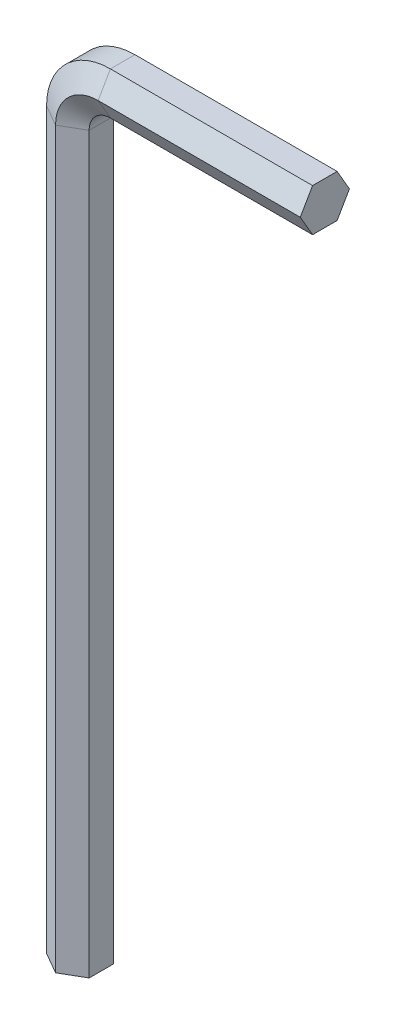
ISO-10303-21;
HEADER;
FILE_DESCRIPTION(('STEP AP214'),'2;1');
FILE_NAME('part.step','',(''),(''),'','','');
FILE_SCHEMA(('AUTOMOTIVE_DESIGN { 1 0 10303 214 1 1 1 1 }'));
ENDSEC;
DATA;
#1=APPLICATION_CONTEXT('core data for automotive mechanical design processes');
#2=APPLICATION_PROTOCOL_DEFINITION('international standard','automotive_design',2000,#1);
#3=PRODUCT_CONTEXT('',#1,'mechanical');
#4=PRODUCT('Part','Part','',(#3));
#5=PRODUCT_RELATED_PRODUCT_CATEGORY('part','',(#4));
#6=PRODUCT_DEFINITION_FORMATION('','',#4);
#7=PRODUCT_DEFINITION_CONTEXT('part definition',#1,'design');
#8=PRODUCT_DEFINITION('design','',#6,#7);
#9=PRODUCT_DEFINITION_SHAPE('','',#8);
#10=(LENGTH_UNIT() NAMED_UNIT(*) SI_UNIT(.MILLI.,.METRE.));
#11=(NAMED_UNIT(*) PLANE_ANGLE_UNIT() SI_UNIT($,.RADIAN.));
#12=(NAMED_UNIT(*) SI_UNIT($,.STERADIAN.) SOLID_ANGLE_UNIT());
#13=UNCERTAINTY_MEASURE_WITH_UNIT(LENGTH_MEASURE(1.E-05),#10,'distance_accuracy_value','');
#14=(GEOMETRIC_REPRESENTATION_CONTEXT(3) GLOBAL_UNCERTAINTY_ASSIGNED_CONTEXT((#13)) GLOBAL_UNIT_ASSIGNED_CONTEXT((#10,
#11,#12)) REPRESENTATION_CONTEXT('',''));
#15=CARTESIAN_POINT('',(0.,0.,0.));
#16=DIRECTION('',(0.,0.,1.));
#17=DIRECTION('',(1.,0.,0.));
#18=AXIS2_PLACEMENT_3D('',#15,#16,#17);
#19=CARTESIAN_POINT('',(0.,0.,0.));
#20=DIRECTION('',(1.,0.,0.));
#21=DIRECTION('',(0.,0.,-1.));
#22=AXIS2_PLACEMENT_3D('',#19,#20,#21);
#23=PLANE('',#22);
#24=DIRECTION('',(0.,0.866025403784438,-0.5));
#25=VECTOR('',#24,1.);
#26=CARTESIAN_POINT('',(0.,-4.,-1.15470053837925));
#27=LINE('',#26,#25);
#28=CARTESIAN_POINT('',(0.,-4.,-1.15470053837925));
#29=VERTEX_POINT('',#28);
#30=CARTESIAN_POINT('',(0.,-2.,-2.3094010767585));
#31=VERTEX_POINT('',#30);
#32=EDGE_CURVE('E198',#29,#31,#27,.T.);
#33=ORIENTED_EDGE('',*,*,#32,.T.);
#34=DIRECTION('',(0.,0.866025403784438,0.5));
#35=VECTOR('',#34,1.);
#36=CARTESIAN_POINT('',(0.,-2.,-2.3094010767585));
#37=LINE('',#36,#35);
#38=CARTESIAN_POINT('',(0.,0.,-1.15470053837925));
#39=VERTEX_POINT('',#38);
#40=EDGE_CURVE('E157',#31,#39,#37,.T.);
#41=ORIENTED_EDGE('',*,*,#40,.T.);
#42=DIRECTION('',(0.,0.,1.));
#43=VECTOR('',#42,1.);
#44=CARTESIAN_POINT('',(0.,0.,-1.15470053837925));
#45=LINE('',#44,#43);
#46=CARTESIAN_POINT('',(0.,0.,1.15470053837925));
#47=VERTEX_POINT('',#46);
#48=EDGE_CURVE('E149',#39,#47,#45,.T.);
#49=ORIENTED_EDGE('',*,*,#48,.T.);
#50=DIRECTION('',(0.,-0.866025403784438,0.5));
#51=VECTOR('',#50,1.);
#52=CARTESIAN_POINT('',(0.,0.,1.15470053837925));
#53=LINE('',#52,#51);
#54=CARTESIAN_POINT('',(0.,-2.,2.3094010767585));
#55=VERTEX_POINT('',#54);
#56=EDGE_CURVE('E142',#47,#55,#53,.T.);
#57=ORIENTED_EDGE('',*,*,#56,.T.);
#58=DIRECTION('',(0.,-0.866025403784438,-0.5));
#59=VECTOR('',#58,1.);
#60=CARTESIAN_POINT('',(0.,-2.,2.3094010767585));
#61=LINE('',#60,#59);
#62=CARTESIAN_POINT('',(0.,-4.,1.15470053837925));
#63=VERTEX_POINT('',#62);
#64=EDGE_CURVE('E223',#55,#63,#61,.T.);
#65=ORIENTED_EDGE('',*,*,#64,.T.);
#66=DIRECTION('',(0.,0.,-1.));
#67=VECTOR('',#66,1.);
#68=CARTESIAN_POINT('',(0.,-4.,1.15470053837925));
#69=LINE('',#68,#67);
#70=EDGE_CURVE('E237',#63,#29,#69,.T.);
#71=ORIENTED_EDGE('',*,*,#70,.T.);
#72=EDGE_LOOP('',(#33,#41,#49,#57,#65,#71));
#73=FACE_BOUND('',#72,.T.);
#74=ADVANCED_FACE('F43',(#73),#23,.T.);
#75=CARTESIAN_POINT('',(-25.,-75.,0.));
#76=DIRECTION('',(0.,1.,0.));
#77=DIRECTION('',(0.,0.,-1.));
#78=AXIS2_PLACEMENT_3D('',#75,#76,#77);
#79=PLANE('',#78);
#80=DIRECTION('',(-0.866025403784438,0.,-0.5));
#81=VECTOR('',#80,1.);
#82=CARTESIAN_POINT('',(-21.,-75.,-1.15470053837925));
#83=LINE('',#82,#81);
#84=CARTESIAN_POINT('',(-21.,-75.,-1.15470053837925));
#85=VERTEX_POINT('',#84);
#86=CARTESIAN_POINT('',(-23.,-75.,-2.3094010767585));
#87=VERTEX_POINT('',#86);
#88=EDGE_CURVE('E171',#85,#87,#83,.T.);
#89=ORIENTED_EDGE('',*,*,#88,.F.);
#90=DIRECTION('',(0.,0.,-1.));
#91=VECTOR('',#90,1.);
#92=CARTESIAN_POINT('',(-21.,-75.,1.15470053837925));
#93=LINE('',#92,#91);
#94=CARTESIAN_POINT('',(-21.,-75.,1.15470053837925));
#95=VERTEX_POINT('',#94);
#96=EDGE_CURVE('E11',#95,#85,#93,.T.);
#97=ORIENTED_EDGE('',*,*,#96,.F.);
#98=DIRECTION('',(0.866025403784438,0.,-0.5));
#99=VECTOR('',#98,1.);
#100=CARTESIAN_POINT('',(-23.,-75.,2.3094010767585));
#101=LINE('',#100,#99);
#102=CARTESIAN_POINT('',(-23.,-75.,2.3094010767585));
#103=VERTEX_POINT('',#102);
#104=EDGE_CURVE('E57',#103,#95,#101,.T.);
#105=ORIENTED_EDGE('',*,*,#104,.F.);
#106=DIRECTION('',(0.866025403784438,0.,0.5));
#107=VECTOR('',#106,1.);
#108=CARTESIAN_POINT('',(-25.,-75.,1.15470053837925));
#109=LINE('',#108,#107);
#110=CARTESIAN_POINT('',(-25.,-75.,1.15470053837925));
#111=VERTEX_POINT('',#110);
#112=EDGE_CURVE('E66',#111,#103,#109,.T.);
#113=ORIENTED_EDGE('',*,*,#112,.F.);
#114=DIRECTION('',(0.,0.,1.));
#115=VECTOR('',#114,1.);
#116=CARTESIAN_POINT('',(-25.,-75.,-1.15470053837925));
#117=LINE('',#116,#115);
#118=CARTESIAN_POINT('',(-25.,-75.,-1.15470053837925));
#119=VERTEX_POINT('',#118);
#120=EDGE_CURVE('E184',#119,#111,#117,.T.);
#121=ORIENTED_EDGE('',*,*,#120,.F.);
#122=DIRECTION('',(-0.866025403784438,0.,0.5));
#123=VECTOR('',#122,1.);
#124=CARTESIAN_POINT('',(-23.,-75.,-2.3094010767585));
#125=LINE('',#124,#123);
#126=EDGE_CURVE('E182',#87,#119,#125,.T.);
#127=ORIENTED_EDGE('',*,*,#126,.F.);
#128=EDGE_LOOP('',(#89,#97,#105,#113,#121,#127));
#129=FACE_BOUND('',#128,.T.);
#130=ADVANCED_FACE('F183',(#129),#79,.F.);
#131=CARTESIAN_POINT('',(0.,-4.,-1.15470053837925));
#132=DIRECTION('',(0.,0.5,0.866025403784439));
#133=DIRECTION('',(0.,-0.866025403784438,0.5));
#134=AXIS2_PLACEMENT_3D('',#131,#132,#133);
#135=PLANE('',#134);
#136=DIRECTION('',(-1.,0.,0.));
#137=VECTOR('',#136,1.);
#138=CARTESIAN_POINT('',(0.,-2.,-2.3094010767585));
#139=LINE('',#138,#137);
#140=CARTESIAN_POINT('',(-19.,-2.,-2.3094010767585));
#141=VERTEX_POINT('',#140);
#142=EDGE_CURVE('E203',#31,#141,#139,.T.);
#143=ORIENTED_EDGE('',*,*,#142,.F.);
#144=ORIENTED_EDGE('',*,*,#32,.F.);
#145=DIRECTION('',(-1.,0.,0.));
#146=VECTOR('',#145,1.);
#147=CARTESIAN_POINT('',(0.,-4.,-1.15470053837925));
#148=LINE('',#147,#146);
#149=CARTESIAN_POINT('',(-19.,-4.,-1.15470053837925));
#150=VERTEX_POINT('',#149);
#151=EDGE_CURVE('E253',#29,#150,#148,.T.);
#152=ORIENTED_EDGE('',*,*,#151,.T.);
#153=DIRECTION('',(0.,0.866025403784438,-0.5));
#154=VECTOR('',#153,1.);
#155=CARTESIAN_POINT('',(-19.,-4.,-1.15470053837925));
#156=LINE('',#155,#154);
#157=EDGE_CURVE('E269',#150,#141,#156,.T.);
#158=ORIENTED_EDGE('',*,*,#157,.T.);
#159=EDGE_LOOP('',(#143,#144,#152,#158));
#160=FACE_BOUND('',#159,.T.);
#161=ADVANCED_FACE('F280',(#160),#135,.F.);
#162=CARTESIAN_POINT('',(0.,-2.,-2.3094010767585));
#163=DIRECTION('',(0.,-0.5,0.866025403784438));
#164=DIRECTION('',(0.,-0.866025403784438,-0.5));
#165=AXIS2_PLACEMENT_3D('',#162,#163,#164);
#166=PLANE('',#165);
#167=DIRECTION('',(-1.,0.,0.));
#168=VECTOR('',#167,1.);
#169=CARTESIAN_POINT('',(0.,0.,-1.15470053837925));
#170=LINE('',#169,#168);
#171=CARTESIAN_POINT('',(-19.,0.,-1.15470053837925));
#172=VERTEX_POINT('',#171);
#173=EDGE_CURVE('E202',#39,#172,#170,.T.);
#174=ORIENTED_EDGE('',*,*,#173,.F.);
#175=ORIENTED_EDGE('',*,*,#40,.F.);
#176=ORIENTED_EDGE('',*,*,#142,.T.);
#177=DIRECTION('',(0.,0.866025403784438,0.5));
#178=VECTOR('',#177,1.);
#179=CARTESIAN_POINT('',(-19.,-2.,-2.3094010767585));
#180=LINE('',#179,#178);
#181=EDGE_CURVE('E199',#141,#172,#180,.T.);
#182=ORIENTED_EDGE('',*,*,#181,.T.);
#183=EDGE_LOOP('',(#174,#175,#176,#182));
#184=FACE_BOUND('',#183,.T.);
#185=ADVANCED_FACE('F281',(#184),#166,.F.);
#186=CARTESIAN_POINT('',(0.,0.,-1.15470053837925));
#187=DIRECTION('',(0.,-1.,0.));
#188=DIRECTION('',(1.,0.,0.));
#189=AXIS2_PLACEMENT_3D('',#186,#187,#188);
#190=PLANE('',#189);
#191=DIRECTION('',(-1.,0.,0.));
#192=VECTOR('',#191,1.);
#193=CARTESIAN_POINT('',(0.,0.,1.15470053837925));
#194=LINE('',#193,#192);
#195=CARTESIAN_POINT('',(-19.,0.,1.15470053837925));
#196=VERTEX_POINT('',#195);
#197=EDGE_CURVE('E214',#47,#196,#194,.T.);
#198=ORIENTED_EDGE('',*,*,#197,.F.);
#199=ORIENTED_EDGE('',*,*,#48,.F.);
#200=ORIENTED_EDGE('',*,*,#173,.T.);
#201=DIRECTION('',(0.,0.,1.));
#202=VECTOR('',#201,1.);
#203=CARTESIAN_POINT('',(-19.,0.,-1.15470053837925));
#204=LINE('',#203,#202);
#205=EDGE_CURVE('E205',#172,#196,#204,.T.);
#206=ORIENTED_EDGE('',*,*,#205,.T.);
#207=EDGE_LOOP('',(#198,#199,#200,#206));
#208=FACE_BOUND('',#207,.T.);
#209=ADVANCED_FACE('F335',(#208),#190,.F.);
#210=CARTESIAN_POINT('',(0.,0.,1.15470053837925));
#211=DIRECTION('',(0.,-0.5,-0.866025403784439));
#212=DIRECTION('',(0.,0.866025403784439,-0.5));
#213=AXIS2_PLACEMENT_3D('',#210,#211,#212);
#214=PLANE('',#213);
#215=DIRECTION('',(-1.,0.,0.));
#216=VECTOR('',#215,1.);
#217=CARTESIAN_POINT('',(0.,-2.,2.3094010767585));
#218=LINE('',#217,#216);
#219=CARTESIAN_POINT('',(-19.,-2.,2.3094010767585));
#220=VERTEX_POINT('',#219);
#221=EDGE_CURVE('E226',#55,#220,#218,.T.);
#222=ORIENTED_EDGE('',*,*,#221,.F.);
#223=ORIENTED_EDGE('',*,*,#56,.F.);
#224=ORIENTED_EDGE('',*,*,#197,.T.);
#225=DIRECTION('',(0.,-0.866025403784438,0.5));
#226=VECTOR('',#225,1.);
#227=CARTESIAN_POINT('',(-19.,0.,1.15470053837925));
#228=LINE('',#227,#226);
#229=EDGE_CURVE('E216',#196,#220,#228,.T.);
#230=ORIENTED_EDGE('',*,*,#229,.T.);
#231=EDGE_LOOP('',(#222,#223,#224,#230));
#232=FACE_BOUND('',#231,.T.);
#233=ADVANCED_FACE('F343',(#232),#214,.F.);
#234=CARTESIAN_POINT('',(0.,-2.,2.3094010767585));
#235=DIRECTION('',(0.,0.5,-0.866025403784439));
#236=DIRECTION('',(0.,0.866025403784439,0.5));
#237=AXIS2_PLACEMENT_3D('',#234,#235,#236);
#238=PLANE('',#237);
#239=DIRECTION('',(-1.,0.,0.));
#240=VECTOR('',#239,1.);
#241=CARTESIAN_POINT('',(0.,-4.,1.15470053837925));
#242=LINE('',#241,#240);
#243=CARTESIAN_POINT('',(-19.,-4.,1.15470053837925));
#244=VERTEX_POINT('',#243);
#245=EDGE_CURVE('E240',#63,#244,#242,.T.);
#246=ORIENTED_EDGE('',*,*,#245,.F.);
#247=ORIENTED_EDGE('',*,*,#64,.F.);
#248=ORIENTED_EDGE('',*,*,#221,.T.);
#249=DIRECTION('',(0.,-0.866025403784438,-0.5));
#250=VECTOR('',#249,1.);
#251=CARTESIAN_POINT('',(-19.,-2.,2.3094010767585));
#252=LINE('',#251,#250);
#253=EDGE_CURVE('E229',#220,#244,#252,.T.);
#254=ORIENTED_EDGE('',*,*,#253,.T.);
#255=EDGE_LOOP('',(#246,#247,#248,#254));
#256=FACE_BOUND('',#255,.T.);
#257=ADVANCED_FACE('F352',(#256),#238,.F.);
#258=CARTESIAN_POINT('',(0.,-4.,1.15470053837925));
#259=DIRECTION('',(0.,1.,0.));
#260=DIRECTION('',(-1.,0.,0.));
#261=AXIS2_PLACEMENT_3D('',#258,#259,#260);
#262=PLANE('',#261);
#263=DIRECTION('',(0.,0.,-1.));
#264=VECTOR('',#263,1.);
#265=CARTESIAN_POINT('',(-19.,-4.,1.15470053837925));
#266=LINE('',#265,#264);
#267=EDGE_CURVE('E243',#244,#150,#266,.T.);
#268=ORIENTED_EDGE('',*,*,#267,.T.);
#269=ORIENTED_EDGE('',*,*,#151,.F.);
#270=ORIENTED_EDGE('',*,*,#70,.F.);
#271=ORIENTED_EDGE('',*,*,#245,.T.);
#272=EDGE_LOOP('',(#268,#269,#270,#271));
#273=FACE_BOUND('',#272,.T.);
#274=ADVANCED_FACE('F292',(#273),#262,.F.);
#275=CARTESIAN_POINT('',(-19.,-6.,-1.15470053837925));
#276=DIRECTION('',(0.,0.,-1.));
#277=DIRECTION('',(-1.,0.,0.));
#278=AXIS2_PLACEMENT_3D('',#275,#276,#277);
#279=CONICAL_SURFACE('',#278,2.,1.0471975511966);
#280=CARTESIAN_POINT('',(-19.,-6.,-2.3094010767585));
#281=DIRECTION('',(0.,0.,1.));
#282=DIRECTION('',(0.,1.,0.));
#283=AXIS2_PLACEMENT_3D('',#280,#281,#282);
#284=CIRCLE('',#283,4.);
#285=CARTESIAN_POINT('',(-23.,-6.,-2.3094010767585));
#286=VERTEX_POINT('',#285);
#287=EDGE_CURVE('E207',#141,#286,#284,.T.);
#288=ORIENTED_EDGE('',*,*,#287,.F.);
#289=ORIENTED_EDGE('',*,*,#157,.F.);
#290=CARTESIAN_POINT('',(-19.,-6.,-1.15470053837925));
#291=DIRECTION('',(0.,0.,1.));
#292=DIRECTION('',(0.,1.,0.));
#293=AXIS2_PLACEMENT_3D('',#290,#291,#292);
#294=CIRCLE('',#293,2.);
#295=CARTESIAN_POINT('',(-21.,-6.,-1.15470053837925));
#296=VERTEX_POINT('',#295);
#297=EDGE_CURVE('E255',#150,#296,#294,.T.);
#298=ORIENTED_EDGE('',*,*,#297,.T.);
#299=DIRECTION('',(-0.866025403784438,0.,-0.5));
#300=VECTOR('',#299,1.);
#301=CARTESIAN_POINT('',(-21.,-6.,-1.15470053837925));
#302=LINE('',#301,#300);
#303=EDGE_CURVE('E263',#296,#286,#302,.T.);
#304=ORIENTED_EDGE('',*,*,#303,.T.);
#305=EDGE_LOOP('',(#288,#289,#298,#304));
#306=FACE_BOUND('',#305,.T.);
#307=ADVANCED_FACE('F267',(#306),#279,.F.);
#308=CARTESIAN_POINT('',(-19.,-6.,-2.3094010767585));
#309=DIRECTION('',(0.,0.,1.));
#310=DIRECTION('',(1.,0.,0.));
#311=AXIS2_PLACEMENT_3D('',#308,#309,#310);
#312=CONICAL_SURFACE('',#311,4.,1.0471975511966);
#313=CARTESIAN_POINT('',(-19.,-6.,-1.15470053837925));
#314=DIRECTION('',(0.,0.,1.));
#315=DIRECTION('',(0.,1.,0.));
#316=AXIS2_PLACEMENT_3D('',#313,#314,#315);
#317=CIRCLE('',#316,6.);
#318=CARTESIAN_POINT('',(-25.,-6.,-1.15470053837925));
#319=VERTEX_POINT('',#318);
#320=EDGE_CURVE('E129',#172,#319,#317,.T.);
#321=ORIENTED_EDGE('',*,*,#320,.F.);
#322=ORIENTED_EDGE('',*,*,#181,.F.);
#323=ORIENTED_EDGE('',*,*,#287,.T.);
#324=DIRECTION('',(-0.866025403784438,0.,0.5));
#325=VECTOR('',#324,1.);
#326=CARTESIAN_POINT('',(-23.,-6.,-2.3094010767585));
#327=LINE('',#326,#325);
#328=EDGE_CURVE('E190',#286,#319,#327,.T.);
#329=ORIENTED_EDGE('',*,*,#328,.T.);
#330=EDGE_LOOP('',(#321,#322,#323,#329));
#331=FACE_BOUND('',#330,.T.);
#332=ADVANCED_FACE('F282',(#331),#312,.T.);
#333=CARTESIAN_POINT('',(-19.,-6.,0.));
#334=DIRECTION('',(0.,0.,1.));
#335=DIRECTION('',(1.,0.,0.));
#336=AXIS2_PLACEMENT_3D('',#333,#334,#335);
#337=CYLINDRICAL_SURFACE('',#336,6.);
#338=CARTESIAN_POINT('',(-19.,-6.,1.15470053837925));
#339=DIRECTION('',(0.,0.,1.));
#340=DIRECTION('',(0.,1.,0.));
#341=AXIS2_PLACEMENT_3D('',#338,#339,#340);
#342=CIRCLE('',#341,6.);
#343=CARTESIAN_POINT('',(-25.,-6.,1.15470053837925));
#344=VERTEX_POINT('',#343);
#345=EDGE_CURVE('E121',#196,#344,#342,.T.);
#346=ORIENTED_EDGE('',*,*,#345,.F.);
#347=ORIENTED_EDGE('',*,*,#205,.F.);
#348=ORIENTED_EDGE('',*,*,#320,.T.);
#349=DIRECTION('',(0.,0.,1.));
#350=VECTOR('',#349,1.);
#351=CARTESIAN_POINT('',(-25.,-6.,-1.15470053837925));
#352=LINE('',#351,#350);
#353=EDGE_CURVE('E208',#319,#344,#352,.T.);
#354=ORIENTED_EDGE('',*,*,#353,.T.);
#355=EDGE_LOOP('',(#346,#347,#348,#354));
#356=FACE_BOUND('',#355,.T.);
#357=ADVANCED_FACE('F284',(#356),#337,.T.);
#358=CARTESIAN_POINT('',(-19.,-6.,1.15470053837925));
#359=DIRECTION('',(0.,0.,-1.));
#360=DIRECTION('',(-1.,0.,0.));
#361=AXIS2_PLACEMENT_3D('',#358,#359,#360);
#362=CONICAL_SURFACE('',#361,6.,1.0471975511966);
#363=CARTESIAN_POINT('',(-19.,-6.,2.3094010767585));
#364=DIRECTION('',(0.,0.,1.));
#365=DIRECTION('',(0.,1.,0.));
#366=AXIS2_PLACEMENT_3D('',#363,#364,#365);
#367=CIRCLE('',#366,4.);
#368=CARTESIAN_POINT('',(-23.,-6.,2.3094010767585));
#369=VERTEX_POINT('',#368);
#370=EDGE_CURVE('E113',#220,#369,#367,.T.);
#371=ORIENTED_EDGE('',*,*,#370,.F.);
#372=ORIENTED_EDGE('',*,*,#229,.F.);
#373=ORIENTED_EDGE('',*,*,#345,.T.);
#374=DIRECTION('',(0.866025403784438,0.,0.5));
#375=VECTOR('',#374,1.);
#376=CARTESIAN_POINT('',(-25.,-6.,1.15470053837925));
#377=LINE('',#376,#375);
#378=EDGE_CURVE('E219',#344,#369,#377,.T.);
#379=ORIENTED_EDGE('',*,*,#378,.T.);
#380=EDGE_LOOP('',(#371,#372,#373,#379));
#381=FACE_BOUND('',#380,.T.);
#382=ADVANCED_FACE('F290',(#381),#362,.T.);
#383=CARTESIAN_POINT('',(-19.,-6.,2.3094010767585));
#384=DIRECTION('',(0.,0.,1.));
#385=DIRECTION('',(1.,0.,0.));
#386=AXIS2_PLACEMENT_3D('',#383,#384,#385);
#387=CONICAL_SURFACE('',#386,4.,1.0471975511966);
#388=CARTESIAN_POINT('',(-19.,-6.,1.15470053837925));
#389=DIRECTION('',(0.,0.,1.));
#390=DIRECTION('',(0.,1.,0.));
#391=AXIS2_PLACEMENT_3D('',#388,#389,#390);
#392=CIRCLE('',#391,2.);
#393=CARTESIAN_POINT('',(-21.,-6.,1.15470053837925));
#394=VERTEX_POINT('',#393);
#395=EDGE_CURVE('E246',#244,#394,#392,.T.);
#396=ORIENTED_EDGE('',*,*,#395,.F.);
#397=ORIENTED_EDGE('',*,*,#253,.F.);
#398=ORIENTED_EDGE('',*,*,#370,.T.);
#399=DIRECTION('',(0.866025403784438,0.,-0.5));
#400=VECTOR('',#399,1.);
#401=CARTESIAN_POINT('',(-23.,-6.,2.3094010767585));
#402=LINE('',#401,#400);
#403=EDGE_CURVE('E232',#369,#394,#402,.T.);
#404=ORIENTED_EDGE('',*,*,#403,.T.);
#405=EDGE_LOOP('',(#396,#397,#398,#404));
#406=FACE_BOUND('',#405,.T.);
#407=ADVANCED_FACE('F394',(#406),#387,.F.);
#408=CARTESIAN_POINT('',(-19.,-6.,0.));
#409=DIRECTION('',(0.,0.,1.));
#410=DIRECTION('',(1.,0.,0.));
#411=AXIS2_PLACEMENT_3D('',#408,#409,#410);
#412=CYLINDRICAL_SURFACE('',#411,2.);
#413=DIRECTION('',(0.,0.,-1.));
#414=VECTOR('',#413,1.);
#415=CARTESIAN_POINT('',(-21.,-6.,1.15470053837925));
#416=LINE('',#415,#414);
#417=EDGE_CURVE('E196',#394,#296,#416,.T.);
#418=ORIENTED_EDGE('',*,*,#417,.T.);
#419=ORIENTED_EDGE('',*,*,#297,.F.);
#420=ORIENTED_EDGE('',*,*,#267,.F.);
#421=ORIENTED_EDGE('',*,*,#395,.T.);
#422=EDGE_LOOP('',(#418,#419,#420,#421));
#423=FACE_BOUND('',#422,.T.);
#424=ADVANCED_FACE('F258',(#423),#412,.F.);
#425=CARTESIAN_POINT('',(-21.,-6.,-1.15470053837925));
#426=DIRECTION('',(-0.5,0.,0.866025403784439));
#427=DIRECTION('',(0.866025403784439,0.,0.5));
#428=AXIS2_PLACEMENT_3D('',#425,#426,#427);
#429=PLANE('',#428);
#430=DIRECTION('',(0.,-1.,0.));
#431=VECTOR('',#430,1.);
#432=CARTESIAN_POINT('',(-23.,-6.,-2.3094010767585));
#433=LINE('',#432,#431);
#434=EDGE_CURVE('E176',#286,#87,#433,.T.);
#435=ORIENTED_EDGE('',*,*,#434,.F.);
#436=ORIENTED_EDGE('',*,*,#303,.F.);
#437=DIRECTION('',(0.,-1.,0.));
#438=VECTOR('',#437,1.);
#439=CARTESIAN_POINT('',(-21.,-6.,-1.15470053837925));
#440=LINE('',#439,#438);
#441=EDGE_CURVE('E178',#296,#85,#440,.T.);
#442=ORIENTED_EDGE('',*,*,#441,.T.);
#443=ORIENTED_EDGE('',*,*,#88,.T.);
#444=EDGE_LOOP('',(#435,#436,#442,#443));
#445=FACE_BOUND('',#444,.T.);
#446=ADVANCED_FACE('F173',(#445),#429,.F.);
#447=CARTESIAN_POINT('',(-23.,-6.,-2.3094010767585));
#448=DIRECTION('',(0.5,0.,0.866025403784438));
#449=DIRECTION('',(0.866025403784438,0.,-0.5));
#450=AXIS2_PLACEMENT_3D('',#447,#448,#449);
#451=PLANE('',#450);
#452=DIRECTION('',(0.,-1.,0.));
#453=VECTOR('',#452,1.);
#454=CARTESIAN_POINT('',(-25.,-6.,-1.15470053837925));
#455=LINE('',#454,#453);
#456=EDGE_CURVE('E187',#319,#119,#455,.T.);
#457=ORIENTED_EDGE('',*,*,#456,.F.);
#458=ORIENTED_EDGE('',*,*,#328,.F.);
#459=ORIENTED_EDGE('',*,*,#434,.T.);
#460=ORIENTED_EDGE('',*,*,#126,.T.);
#461=EDGE_LOOP('',(#457,#458,#459,#460));
#462=FACE_BOUND('',#461,.T.);
#463=ADVANCED_FACE('F189',(#462),#451,.F.);
#464=CARTESIAN_POINT('',(-25.,-6.,-1.15470053837925));
#465=DIRECTION('',(1.,0.,0.));
#466=DIRECTION('',(0.,1.,0.));
#467=AXIS2_PLACEMENT_3D('',#464,#465,#466);
#468=PLANE('',#467);
#469=DIRECTION('',(0.,-1.,0.));
#470=VECTOR('',#469,1.);
#471=CARTESIAN_POINT('',(-25.,-6.,1.15470053837925));
#472=LINE('',#471,#470);
#473=EDGE_CURVE('E98',#344,#111,#472,.T.);
#474=ORIENTED_EDGE('',*,*,#473,.F.);
#475=ORIENTED_EDGE('',*,*,#353,.F.);
#476=ORIENTED_EDGE('',*,*,#456,.T.);
#477=ORIENTED_EDGE('',*,*,#120,.T.);
#478=EDGE_LOOP('',(#474,#475,#476,#477));
#479=FACE_BOUND('',#478,.T.);
#480=ADVANCED_FACE('F427',(#479),#468,.F.);
#481=CARTESIAN_POINT('',(-25.,-6.,1.15470053837925));
#482=DIRECTION('',(0.5,0.,-0.866025403784439));
#483=DIRECTION('',(-0.866025403784439,0.,-0.5));
#484=AXIS2_PLACEMENT_3D('',#481,#482,#483);
#485=PLANE('',#484);
#486=DIRECTION('',(0.,-1.,0.));
#487=VECTOR('',#486,1.);
#488=CARTESIAN_POINT('',(-23.,-6.,2.3094010767585));
#489=LINE('',#488,#487);
#490=EDGE_CURVE('E92',#369,#103,#489,.T.);
#491=ORIENTED_EDGE('',*,*,#490,.F.);
#492=ORIENTED_EDGE('',*,*,#378,.F.);
#493=ORIENTED_EDGE('',*,*,#473,.T.);
#494=ORIENTED_EDGE('',*,*,#112,.T.);
#495=EDGE_LOOP('',(#491,#492,#493,#494));
#496=FACE_BOUND('',#495,.T.);
#497=ADVANCED_FACE('F303',(#496),#485,.F.);
#498=CARTESIAN_POINT('',(-23.,-6.,2.3094010767585));
#499=DIRECTION('',(-0.5,0.,-0.866025403784439));
#500=DIRECTION('',(-0.866025403784439,0.,0.5));
#501=AXIS2_PLACEMENT_3D('',#498,#499,#500);
#502=PLANE('',#501);
#503=DIRECTION('',(0.,-1.,0.));
#504=VECTOR('',#503,1.);
#505=CARTESIAN_POINT('',(-21.,-6.,1.15470053837925));
#506=LINE('',#505,#504);
#507=EDGE_CURVE('E50',#394,#95,#506,.T.);
#508=ORIENTED_EDGE('',*,*,#507,.F.);
#509=ORIENTED_EDGE('',*,*,#403,.F.);
#510=ORIENTED_EDGE('',*,*,#490,.T.);
#511=ORIENTED_EDGE('',*,*,#104,.T.);
#512=EDGE_LOOP('',(#508,#509,#510,#511));
#513=FACE_BOUND('',#512,.T.);
#514=ADVANCED_FACE('F298',(#513),#502,.F.);
#515=CARTESIAN_POINT('',(-21.,-6.,1.15470053837925));
#516=DIRECTION('',(-1.,0.,0.));
#517=DIRECTION('',(0.,-1.,0.));
#518=AXIS2_PLACEMENT_3D('',#515,#516,#517);
#519=PLANE('',#518);
#520=ORIENTED_EDGE('',*,*,#96,.T.);
#521=ORIENTED_EDGE('',*,*,#441,.F.);
#522=ORIENTED_EDGE('',*,*,#417,.F.);
#523=ORIENTED_EDGE('',*,*,#507,.T.);
#524=EDGE_LOOP('',(#520,#521,#522,#523));
#525=FACE_BOUND('',#524,.T.);
#526=ADVANCED_FACE('F296',(#525),#519,.F.);
#527=CLOSED_SHELL('',(#74,#130,#161,#185,#209,#233,#257,#274,#307,#332,#357,#382,#407,#424,#446,
#463,#480,#497,#514,#526));
#528=MANIFOLD_SOLID_BREP('B2',#527);
#529=ADVANCED_BREP_SHAPE_REPRESENTATION('',(#18,#528),#14);
#530=SHAPE_DEFINITION_REPRESENTATION(#9,#529);
ENDSEC;
END-ISO-10303-21;
